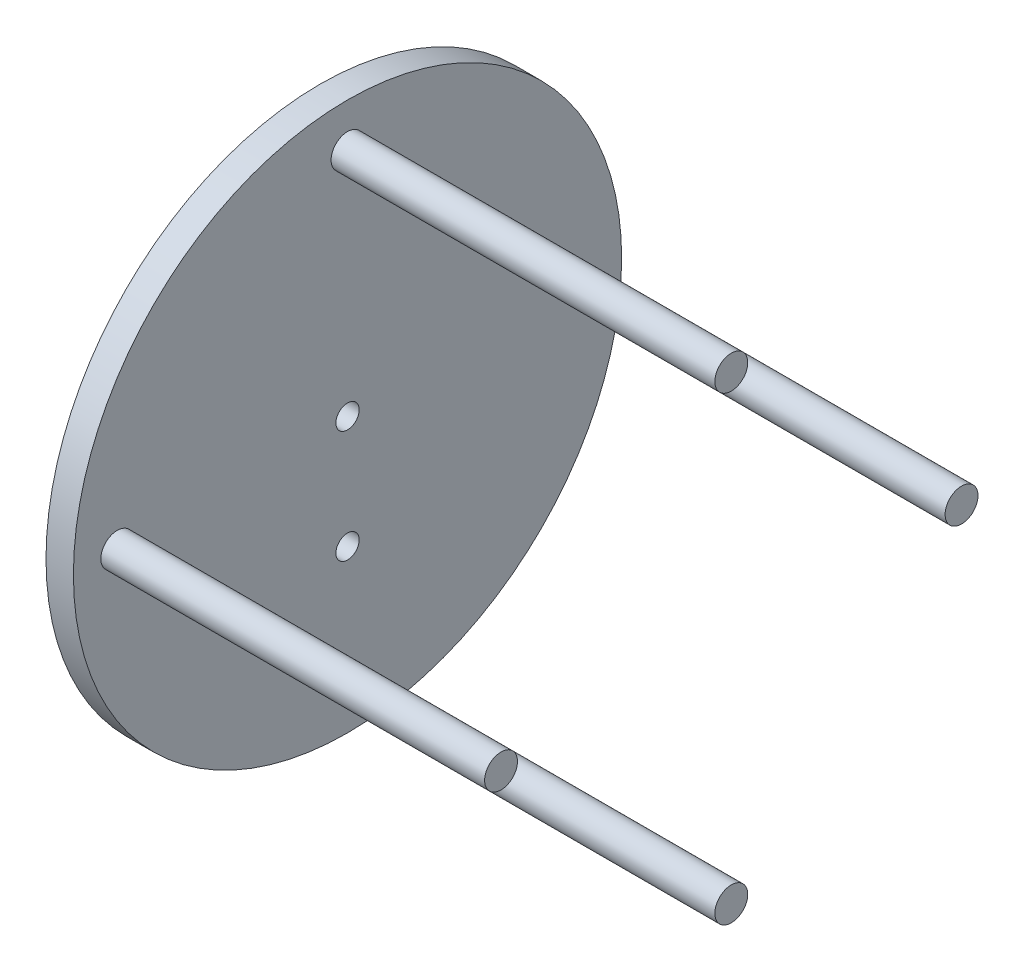
ISO-10303-21;
HEADER;
FILE_DESCRIPTION(('STEP AP214'),'2;1');
FILE_NAME('part.step','',(''),(''),'','','');
FILE_SCHEMA(('AUTOMOTIVE_DESIGN { 1 0 10303 214 1 1 1 1 }'));
ENDSEC;
DATA;
#1=APPLICATION_CONTEXT('core data for automotive mechanical design processes');
#2=APPLICATION_PROTOCOL_DEFINITION('international standard','automotive_design',2000,#1);
#3=PRODUCT_CONTEXT('',#1,'mechanical');
#4=PRODUCT('Part','Part','',(#3));
#5=PRODUCT_RELATED_PRODUCT_CATEGORY('part','',(#4));
#6=PRODUCT_DEFINITION_FORMATION('','',#4);
#7=PRODUCT_DEFINITION_CONTEXT('part definition',#1,'design');
#8=PRODUCT_DEFINITION('design','',#6,#7);
#9=PRODUCT_DEFINITION_SHAPE('','',#8);
#10=(LENGTH_UNIT() NAMED_UNIT(*) SI_UNIT(.MILLI.,.METRE.));
#11=(NAMED_UNIT(*) PLANE_ANGLE_UNIT() SI_UNIT($,.RADIAN.));
#12=(NAMED_UNIT(*) SI_UNIT($,.STERADIAN.) SOLID_ANGLE_UNIT());
#13=UNCERTAINTY_MEASURE_WITH_UNIT(LENGTH_MEASURE(1.E-05),#10,'distance_accuracy_value','');
#14=(GEOMETRIC_REPRESENTATION_CONTEXT(3) GLOBAL_UNCERTAINTY_ASSIGNED_CONTEXT((#13)) GLOBAL_UNIT_ASSIGNED_CONTEXT((#10,
#11,#12)) REPRESENTATION_CONTEXT('',''));
#15=CARTESIAN_POINT('',(0.,0.,0.));
#16=DIRECTION('',(0.,0.,1.));
#17=DIRECTION('',(1.,0.,0.));
#18=AXIS2_PLACEMENT_3D('',#15,#16,#17);
#19=CARTESIAN_POINT('',(5.,0.,0.));
#20=DIRECTION('',(-1.,0.,0.));
#21=DIRECTION('',(0.,0.,1.));
#22=AXIS2_PLACEMENT_3D('',#19,#20,#21);
#23=CYLINDRICAL_SURFACE('',#22,50.);
#24=CARTESIAN_POINT('',(5.,0.,0.));
#25=DIRECTION('',(1.,0.,0.));
#26=DIRECTION('',(0.,0.,-1.));
#27=AXIS2_PLACEMENT_3D('',#24,#25,#26);
#28=CIRCLE('',#27,50.);
#29=CARTESIAN_POINT('',(5.,0.,-50.));
#30=VERTEX_POINT('',#29);
#31=EDGE_CURVE('E10',#30,#30,#28,.T.);
#32=ORIENTED_EDGE('',*,*,#31,.F.);
#33=EDGE_LOOP('',(#32));
#34=FACE_BOUND('',#33,.T.);
#35=CARTESIAN_POINT('',(0.,0.,0.));
#36=DIRECTION('',(1.,0.,0.));
#37=DIRECTION('',(0.,0.,-1.));
#38=AXIS2_PLACEMENT_3D('',#35,#36,#37);
#39=CIRCLE('',#38,50.);
#40=CARTESIAN_POINT('',(0.,0.,-50.));
#41=VERTEX_POINT('',#40);
#42=EDGE_CURVE('E45',#41,#41,#39,.T.);
#43=ORIENTED_EDGE('',*,*,#42,.T.);
#44=EDGE_LOOP('',(#43));
#45=FACE_BOUND('',#44,.T.);
#46=ADVANCED_FACE('F37',(#34,#45),#23,.T.);
#47=CARTESIAN_POINT('',(5.,0.,0.));
#48=DIRECTION('',(1.,0.,0.));
#49=DIRECTION('',(0.,0.,-1.));
#50=AXIS2_PLACEMENT_3D('',#47,#48,#49);
#51=PLANE('',#50);
#52=CARTESIAN_POINT('',(5.,0.,0.));
#53=DIRECTION('',(1.,0.,0.));
#54=DIRECTION('',(0.,0.,-1.));
#55=AXIS2_PLACEMENT_3D('',#52,#53,#54);
#56=CIRCLE('',#55,2.125);
#57=CARTESIAN_POINT('',(5.,0.,-2.125));
#58=VERTEX_POINT('',#57);
#59=EDGE_CURVE('E59',#58,#58,#56,.T.);
#60=ORIENTED_EDGE('',*,*,#59,.F.);
#61=EDGE_LOOP('',(#60));
#62=FACE_BOUND('',#61,.T.);
#63=CARTESIAN_POINT('',(5.,-20.5478435584538,0.));
#64=DIRECTION('',(1.,0.,0.));
#65=DIRECTION('',(0.,0.,-1.));
#66=AXIS2_PLACEMENT_3D('',#63,#64,#65);
#67=CIRCLE('',#66,2.125);
#68=CARTESIAN_POINT('',(5.,-20.5478435584538,-2.125));
#69=VERTEX_POINT('',#68);
#70=EDGE_CURVE('E67',#69,#69,#67,.T.);
#71=ORIENTED_EDGE('',*,*,#70,.F.);
#72=EDGE_LOOP('',(#71));
#73=FACE_BOUND('',#72,.T.);
#74=CARTESIAN_POINT('',(5.,42.,0.));
#75=DIRECTION('',(1.,0.,0.));
#76=DIRECTION('',(0.,0.,-1.));
#77=AXIS2_PLACEMENT_3D('',#74,#75,#76);
#78=CIRCLE('',#77,3.);
#79=CARTESIAN_POINT('',(5.,42.,-3.));
#80=VERTEX_POINT('',#79);
#81=EDGE_CURVE('E65',#80,#80,#78,.T.);
#82=ORIENTED_EDGE('',*,*,#81,.F.);
#83=EDGE_LOOP('',(#82));
#84=FACE_BOUND('',#83,.T.);
#85=CARTESIAN_POINT('',(5.,-42.,0.));
#86=DIRECTION('',(1.,0.,0.));
#87=DIRECTION('',(0.,0.,-1.));
#88=AXIS2_PLACEMENT_3D('',#85,#86,#87);
#89=CIRCLE('',#88,3.);
#90=CARTESIAN_POINT('',(5.,-42.,-3.00000000000001));
#91=VERTEX_POINT('',#90);
#92=EDGE_CURVE('E79',#91,#91,#89,.T.);
#93=ORIENTED_EDGE('',*,*,#92,.F.);
#94=EDGE_LOOP('',(#93));
#95=FACE_BOUND('',#94,.T.);
#96=CARTESIAN_POINT('',(5.,0.,-42.));
#97=DIRECTION('',(1.,0.,0.));
#98=DIRECTION('',(0.,0.,-1.));
#99=AXIS2_PLACEMENT_3D('',#96,#97,#98);
#100=CIRCLE('',#99,3.);
#101=CARTESIAN_POINT('',(5.,0.,-45.));
#102=VERTEX_POINT('',#101);
#103=EDGE_CURVE('E87',#102,#102,#100,.T.);
#104=ORIENTED_EDGE('',*,*,#103,.F.);
#105=EDGE_LOOP('',(#104));
#106=FACE_BOUND('',#105,.T.);
#107=CARTESIAN_POINT('',(5.,0.,42.));
#108=DIRECTION('',(1.,0.,0.));
#109=DIRECTION('',(0.,0.,-1.));
#110=AXIS2_PLACEMENT_3D('',#107,#108,#109);
#111=CIRCLE('',#110,3.);
#112=CARTESIAN_POINT('',(5.,0.,39.));
#113=VERTEX_POINT('',#112);
#114=EDGE_CURVE('E54',#113,#113,#111,.T.);
#115=ORIENTED_EDGE('',*,*,#114,.F.);
#116=EDGE_LOOP('',(#115));
#117=FACE_BOUND('',#116,.T.);
#118=ORIENTED_EDGE('',*,*,#31,.T.);
#119=EDGE_LOOP('',(#118));
#120=FACE_BOUND('',#119,.T.);
#121=ADVANCED_FACE('F107',(#62,#73,#84,#95,#106,#117,#120),#51,.T.);
#122=CARTESIAN_POINT('',(0.,0.,0.));
#123=DIRECTION('',(1.,0.,0.));
#124=DIRECTION('',(0.,0.,-1.));
#125=AXIS2_PLACEMENT_3D('',#122,#123,#124);
#126=PLANE('',#125);
#127=CARTESIAN_POINT('',(0.,0.,0.));
#128=DIRECTION('',(1.,0.,0.));
#129=DIRECTION('',(0.,0.,-1.));
#130=AXIS2_PLACEMENT_3D('',#127,#128,#129);
#131=CIRCLE('',#130,2.125);
#132=CARTESIAN_POINT('',(0.,0.,-2.125));
#133=VERTEX_POINT('',#132);
#134=EDGE_CURVE('E40',#133,#133,#131,.T.);
#135=ORIENTED_EDGE('',*,*,#134,.T.);
#136=EDGE_LOOP('',(#135));
#137=FACE_BOUND('',#136,.T.);
#138=CARTESIAN_POINT('',(0.,-20.5478435584538,0.));
#139=DIRECTION('',(1.,0.,0.));
#140=DIRECTION('',(0.,0.,-1.));
#141=AXIS2_PLACEMENT_3D('',#138,#139,#140);
#142=CIRCLE('',#141,2.125);
#143=CARTESIAN_POINT('',(0.,-20.5478435584538,-2.125));
#144=VERTEX_POINT('',#143);
#145=EDGE_CURVE('E56',#144,#144,#142,.T.);
#146=ORIENTED_EDGE('',*,*,#145,.T.);
#147=EDGE_LOOP('',(#146));
#148=FACE_BOUND('',#147,.T.);
#149=ORIENTED_EDGE('',*,*,#42,.F.);
#150=EDGE_LOOP('',(#149));
#151=FACE_BOUND('',#150,.T.);
#152=ADVANCED_FACE('F109',(#137,#148,#151),#126,.F.);
#153=CARTESIAN_POINT('',(75.,0.,42.));
#154=DIRECTION('',(-1.,0.,0.));
#155=DIRECTION('',(0.,0.,1.));
#156=AXIS2_PLACEMENT_3D('',#153,#154,#155);
#157=CYLINDRICAL_SURFACE('',#156,3.);
#158=CARTESIAN_POINT('',(75.,0.,42.));
#159=DIRECTION('',(1.,0.,0.));
#160=DIRECTION('',(0.,0.,-1.));
#161=AXIS2_PLACEMENT_3D('',#158,#159,#160);
#162=CIRCLE('',#161,3.);
#163=CARTESIAN_POINT('',(75.,0.,39.));
#164=VERTEX_POINT('',#163);
#165=EDGE_CURVE('E51',#164,#164,#162,.T.);
#166=ORIENTED_EDGE('',*,*,#165,.F.);
#167=EDGE_LOOP('',(#166));
#168=FACE_BOUND('',#167,.T.);
#169=ORIENTED_EDGE('',*,*,#114,.T.);
#170=EDGE_LOOP('',(#169));
#171=FACE_BOUND('',#170,.T.);
#172=ADVANCED_FACE('F105',(#168,#171),#157,.T.);
#173=CARTESIAN_POINT('',(75.,0.,42.));
#174=DIRECTION('',(1.,0.,0.));
#175=DIRECTION('',(0.,0.,-1.));
#176=AXIS2_PLACEMENT_3D('',#173,#174,#175);
#177=PLANE('',#176);
#178=ORIENTED_EDGE('',*,*,#165,.T.);
#179=EDGE_LOOP('',(#178));
#180=FACE_BOUND('',#179,.T.);
#181=ADVANCED_FACE('F122',(#180),#177,.T.);
#182=CARTESIAN_POINT('',(75.,0.,-42.));
#183=DIRECTION('',(-1.,0.,0.));
#184=DIRECTION('',(0.,0.,1.));
#185=AXIS2_PLACEMENT_3D('',#182,#183,#184);
#186=CYLINDRICAL_SURFACE('',#185,3.);
#187=CARTESIAN_POINT('',(75.,0.,-42.));
#188=DIRECTION('',(1.,0.,0.));
#189=DIRECTION('',(0.,0.,-1.));
#190=AXIS2_PLACEMENT_3D('',#187,#188,#189);
#191=CIRCLE('',#190,3.);
#192=CARTESIAN_POINT('',(75.,0.,-45.));
#193=VERTEX_POINT('',#192);
#194=EDGE_CURVE('E91',#193,#193,#191,.T.);
#195=ORIENTED_EDGE('',*,*,#194,.F.);
#196=EDGE_LOOP('',(#195));
#197=FACE_BOUND('',#196,.T.);
#198=ORIENTED_EDGE('',*,*,#103,.T.);
#199=EDGE_LOOP('',(#198));
#200=FACE_BOUND('',#199,.T.);
#201=ADVANCED_FACE('F126',(#197,#200),#186,.T.);
#202=CARTESIAN_POINT('',(75.,0.,-42.));
#203=DIRECTION('',(1.,0.,0.));
#204=DIRECTION('',(0.,0.,-1.));
#205=AXIS2_PLACEMENT_3D('',#202,#203,#204);
#206=PLANE('',#205);
#207=ORIENTED_EDGE('',*,*,#194,.T.);
#208=EDGE_LOOP('',(#207));
#209=FACE_BOUND('',#208,.T.);
#210=ADVANCED_FACE('F129',(#209),#206,.T.);
#211=CARTESIAN_POINT('',(75.,-42.,0.));
#212=DIRECTION('',(-1.,0.,0.));
#213=DIRECTION('',(0.,0.,1.));
#214=AXIS2_PLACEMENT_3D('',#211,#212,#213);
#215=CYLINDRICAL_SURFACE('',#214,3.);
#216=CARTESIAN_POINT('',(75.,-42.,0.));
#217=DIRECTION('',(1.,0.,0.));
#218=DIRECTION('',(0.,0.,-1.));
#219=AXIS2_PLACEMENT_3D('',#216,#217,#218);
#220=CIRCLE('',#219,3.);
#221=CARTESIAN_POINT('',(75.,-42.,-3.00000000000001));
#222=VERTEX_POINT('',#221);
#223=EDGE_CURVE('E83',#222,#222,#220,.T.);
#224=ORIENTED_EDGE('',*,*,#223,.F.);
#225=EDGE_LOOP('',(#224));
#226=FACE_BOUND('',#225,.T.);
#227=ORIENTED_EDGE('',*,*,#92,.T.);
#228=EDGE_LOOP('',(#227));
#229=FACE_BOUND('',#228,.T.);
#230=ADVANCED_FACE('F133',(#226,#229),#215,.T.);
#231=CARTESIAN_POINT('',(75.,-42.,0.));
#232=DIRECTION('',(1.,0.,0.));
#233=DIRECTION('',(0.,0.,-1.));
#234=AXIS2_PLACEMENT_3D('',#231,#232,#233);
#235=PLANE('',#234);
#236=ORIENTED_EDGE('',*,*,#223,.T.);
#237=EDGE_LOOP('',(#236));
#238=FACE_BOUND('',#237,.T.);
#239=ADVANCED_FACE('F137',(#238),#235,.T.);
#240=CARTESIAN_POINT('',(75.,42.,0.));
#241=DIRECTION('',(-1.,0.,0.));
#242=DIRECTION('',(0.,0.,1.));
#243=AXIS2_PLACEMENT_3D('',#240,#241,#242);
#244=CYLINDRICAL_SURFACE('',#243,3.);
#245=CARTESIAN_POINT('',(75.,42.,0.));
#246=DIRECTION('',(1.,0.,0.));
#247=DIRECTION('',(0.,0.,-1.));
#248=AXIS2_PLACEMENT_3D('',#245,#246,#247);
#249=CIRCLE('',#248,3.);
#250=CARTESIAN_POINT('',(75.,42.,-3.));
#251=VERTEX_POINT('',#250);
#252=EDGE_CURVE('E75',#251,#251,#249,.T.);
#253=ORIENTED_EDGE('',*,*,#252,.F.);
#254=EDGE_LOOP('',(#253));
#255=FACE_BOUND('',#254,.T.);
#256=ORIENTED_EDGE('',*,*,#81,.T.);
#257=EDGE_LOOP('',(#256));
#258=FACE_BOUND('',#257,.T.);
#259=ADVANCED_FACE('F141',(#255,#258),#244,.T.);
#260=CARTESIAN_POINT('',(75.,42.,0.));
#261=DIRECTION('',(1.,0.,0.));
#262=DIRECTION('',(0.,0.,-1.));
#263=AXIS2_PLACEMENT_3D('',#260,#261,#262);
#264=PLANE('',#263);
#265=ORIENTED_EDGE('',*,*,#252,.T.);
#266=EDGE_LOOP('',(#265));
#267=FACE_BOUND('',#266,.T.);
#268=ADVANCED_FACE('F145',(#267),#264,.T.);
#269=CARTESIAN_POINT('',(-65.,-20.5478435584538,0.));
#270=DIRECTION('',(1.,0.,0.));
#271=DIRECTION('',(0.,0.,-1.));
#272=AXIS2_PLACEMENT_3D('',#269,#270,#271);
#273=CYLINDRICAL_SURFACE('',#272,2.125);
#274=ORIENTED_EDGE('',*,*,#70,.T.);
#275=EDGE_LOOP('',(#274));
#276=FACE_BOUND('',#275,.T.);
#277=ORIENTED_EDGE('',*,*,#145,.F.);
#278=EDGE_LOOP('',(#277));
#279=FACE_BOUND('',#278,.T.);
#280=ADVANCED_FACE('F149',(#276,#279),#273,.F.);
#281=CARTESIAN_POINT('',(-65.,0.,0.));
#282=DIRECTION('',(1.,0.,0.));
#283=DIRECTION('',(0.,0.,-1.));
#284=AXIS2_PLACEMENT_3D('',#281,#282,#283);
#285=CYLINDRICAL_SURFACE('',#284,2.125);
#286=ORIENTED_EDGE('',*,*,#59,.T.);
#287=EDGE_LOOP('',(#286));
#288=FACE_BOUND('',#287,.T.);
#289=ORIENTED_EDGE('',*,*,#134,.F.);
#290=EDGE_LOOP('',(#289));
#291=FACE_BOUND('',#290,.T.);
#292=ADVANCED_FACE('F153',(#288,#291),#285,.F.);
#293=CLOSED_SHELL('',(#46,#121,#152,#172,#181,#201,#210,#230,#239,#259,#268,#280,#292));
#294=MANIFOLD_SOLID_BREP('B2',#293);
#295=ADVANCED_BREP_SHAPE_REPRESENTATION('',(#18,#294),#14);
#296=SHAPE_DEFINITION_REPRESENTATION(#9,#295);
ENDSEC;
END-ISO-10303-21;
